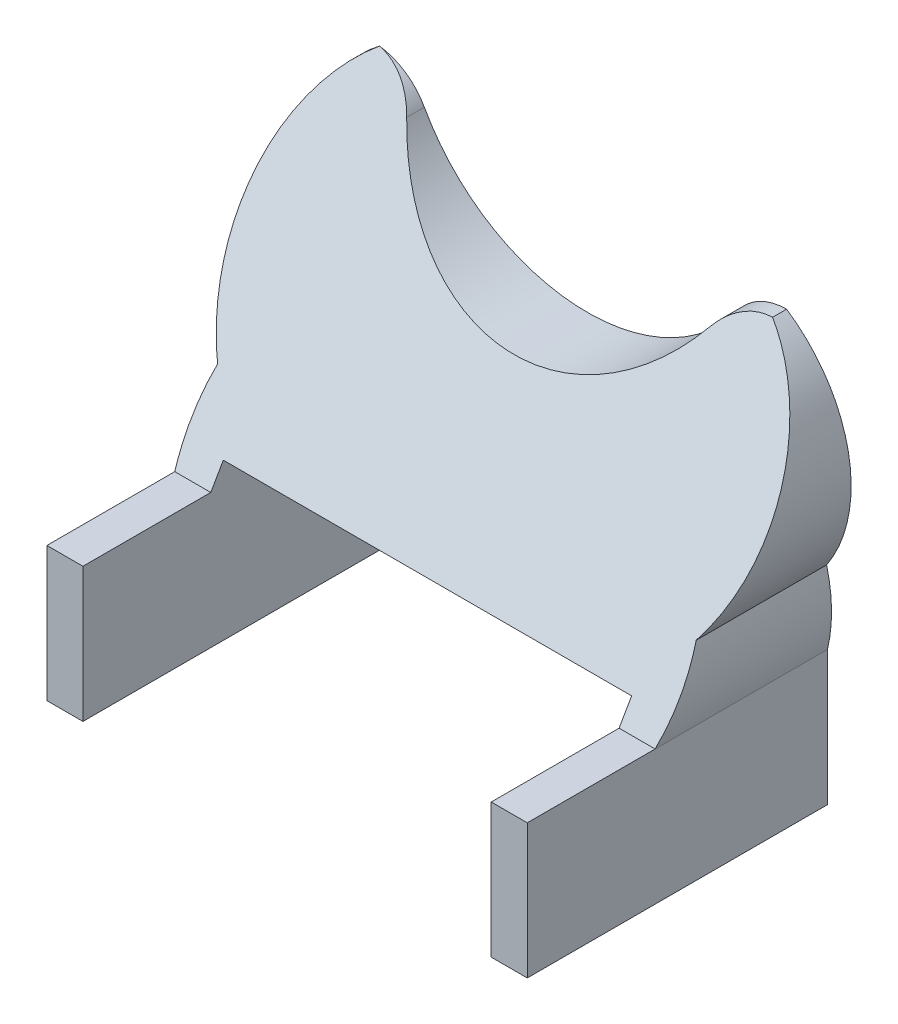
ISO-10303-21;
HEADER;
FILE_DESCRIPTION(('STEP AP214'),'2;1');
FILE_NAME('part.step','',(''),(''),'','','');
FILE_SCHEMA(('AUTOMOTIVE_DESIGN { 1 0 10303 214 1 1 1 1 }'));
ENDSEC;
DATA;
#1=APPLICATION_CONTEXT('core data for automotive mechanical design processes');
#2=APPLICATION_PROTOCOL_DEFINITION('international standard','automotive_design',2000,#1);
#3=PRODUCT_CONTEXT('',#1,'mechanical');
#4=PRODUCT('Part','Part','',(#3));
#5=PRODUCT_RELATED_PRODUCT_CATEGORY('part','',(#4));
#6=PRODUCT_DEFINITION_FORMATION('','',#4);
#7=PRODUCT_DEFINITION_CONTEXT('part definition',#1,'design');
#8=PRODUCT_DEFINITION('design','',#6,#7);
#9=PRODUCT_DEFINITION_SHAPE('','',#8);
#10=(LENGTH_UNIT() NAMED_UNIT(*) SI_UNIT(.MILLI.,.METRE.));
#11=(NAMED_UNIT(*) PLANE_ANGLE_UNIT() SI_UNIT($,.RADIAN.));
#12=(NAMED_UNIT(*) SI_UNIT($,.STERADIAN.) SOLID_ANGLE_UNIT());
#13=UNCERTAINTY_MEASURE_WITH_UNIT(LENGTH_MEASURE(1.E-05),#10,'distance_accuracy_value','');
#14=(GEOMETRIC_REPRESENTATION_CONTEXT(3) GLOBAL_UNCERTAINTY_ASSIGNED_CONTEXT((#13)) GLOBAL_UNIT_ASSIGNED_CONTEXT((#10,
#11,#12)) REPRESENTATION_CONTEXT('',''));
#15=CARTESIAN_POINT('',(0.,0.,0.));
#16=DIRECTION('',(0.,0.,1.));
#17=DIRECTION('',(1.,0.,0.));
#18=AXIS2_PLACEMENT_3D('',#15,#16,#17);
#19=CARTESIAN_POINT('',(0.,0.,25.));
#20=DIRECTION('',(0.,0.,-1.));
#21=DIRECTION('',(-1.,0.,0.));
#22=AXIS2_PLACEMENT_3D('',#19,#20,#21);
#23=PLANE('',#22);
#24=DIRECTION('',(1.,0.,0.));
#25=VECTOR('',#24,1.);
#26=CARTESIAN_POINT('',(-1.40000525819556E-13,-41.,25.));
#27=LINE('',#26,#25);
#28=CARTESIAN_POINT('',(-20.0000000000001,-41.,25.));
#29=VERTEX_POINT('',#28);
#30=CARTESIAN_POINT('',(-17.0000000000001,-41.,25.));
#31=VERTEX_POINT('',#30);
#32=EDGE_CURVE('E220',#29,#31,#27,.T.);
#33=ORIENTED_EDGE('',*,*,#32,.T.);
#34=DIRECTION('',(0.,-1.,0.));
#35=VECTOR('',#34,1.);
#36=CARTESIAN_POINT('',(-17.0000000000001,-28.,25.));
#37=LINE('',#36,#35);
#38=CARTESIAN_POINT('',(-17.0000000000001,-29.8077141482739,25.));
#39=VERTEX_POINT('',#38);
#40=EDGE_CURVE('E175',#39,#31,#37,.T.);
#41=ORIENTED_EDGE('',*,*,#40,.F.);
#42=DIRECTION('',(-1.,0.,0.));
#43=VECTOR('',#42,1.);
#44=CARTESIAN_POINT('',(19.9999999999999,-29.8077141482739,25.));
#45=LINE('',#44,#43);
#46=CARTESIAN_POINT('',(-20.0000000000001,-29.8077141482739,25.));
#47=VERTEX_POINT('',#46);
#48=EDGE_CURVE('E227',#39,#47,#45,.T.);
#49=ORIENTED_EDGE('',*,*,#48,.T.);
#50=DIRECTION('',(0.,-1.,0.));
#51=VECTOR('',#50,1.);
#52=CARTESIAN_POINT('',(-20.0000000000001,-29.8077141482739,25.));
#53=LINE('',#52,#51);
#54=EDGE_CURVE('E231',#47,#29,#53,.T.);
#55=ORIENTED_EDGE('',*,*,#54,.T.);
#56=EDGE_LOOP('',(#33,#41,#49,#55));
#57=FACE_BOUND('',#56,.T.);
#58=ADVANCED_FACE('F37',(#57),#23,.F.);
#59=CARTESIAN_POINT('',(19.9999999999999,-29.8077141482739,25.));
#60=DIRECTION('',(0.,-1.,0.));
#61=DIRECTION('',(1.,0.,0.));
#62=AXIS2_PLACEMENT_3D('',#59,#60,#61);
#63=PLANE('',#62);
#64=ORIENTED_EDGE('',*,*,#48,.F.);
#65=DIRECTION('',(0.,0.,-1.));
#66=VECTOR('',#65,1.);
#67=CARTESIAN_POINT('',(-17.0000000000001,-29.8077141482739,25.));
#68=LINE('',#67,#66);
#69=CARTESIAN_POINT('',(-17.0000000000001,-29.8077141482739,14.354853718367));
#70=VERTEX_POINT('',#69);
#71=EDGE_CURVE('E183',#39,#70,#68,.T.);
#72=ORIENTED_EDGE('',*,*,#71,.T.);
#73=DIRECTION('',(-1.,0.,0.));
#74=VECTOR('',#73,1.);
#75=CARTESIAN_POINT('',(25.,-29.8077141482739,14.354853718367));
#76=LINE('',#75,#74);
#77=CARTESIAN_POINT('',(-20.0000000000001,-29.8077141482739,14.354853718367));
#78=VERTEX_POINT('',#77);
#79=EDGE_CURVE('E187',#70,#78,#76,.T.);
#80=ORIENTED_EDGE('',*,*,#79,.T.);
#81=DIRECTION('',(0.,0.,-1.));
#82=VECTOR('',#81,1.);
#83=CARTESIAN_POINT('',(-20.0000000000001,-29.8077141482739,25.));
#84=LINE('',#83,#82);
#85=EDGE_CURVE('E244',#47,#78,#84,.T.);
#86=ORIENTED_EDGE('',*,*,#85,.F.);
#87=EDGE_LOOP('',(#64,#72,#80,#86));
#88=FACE_BOUND('',#87,.T.);
#89=ADVANCED_FACE('F340',(#88),#63,.F.);
#90=CARTESIAN_POINT('',(-1.40000525819556E-13,-41.,25.));
#91=DIRECTION('',(0.,1.,0.));
#92=DIRECTION('',(0.,0.,1.));
#93=AXIS2_PLACEMENT_3D('',#90,#91,#92);
#94=PLANE('',#93);
#95=DIRECTION('',(1.,0.,0.));
#96=VECTOR('',#95,1.);
#97=CARTESIAN_POINT('',(-1.40000525819556E-13,-41.,0.));
#98=LINE('',#97,#96);
#99=CARTESIAN_POINT('',(-20.0000000000001,-41.,0.));
#100=VERTEX_POINT('',#99);
#101=CARTESIAN_POINT('',(-17.0000000000001,-41.,0.));
#102=VERTEX_POINT('',#101);
#103=EDGE_CURVE('E239',#100,#102,#98,.T.);
#104=ORIENTED_EDGE('',*,*,#103,.T.);
#105=DIRECTION('',(0.,0.,-1.));
#106=VECTOR('',#105,1.);
#107=CARTESIAN_POINT('',(-17.0000000000001,-41.,25.));
#108=LINE('',#107,#106);
#109=EDGE_CURVE('E166',#31,#102,#108,.T.);
#110=ORIENTED_EDGE('',*,*,#109,.F.);
#111=ORIENTED_EDGE('',*,*,#32,.F.);
#112=DIRECTION('',(0.,0.,-1.));
#113=VECTOR('',#112,1.);
#114=CARTESIAN_POINT('',(-20.0000000000001,-41.,25.));
#115=LINE('',#114,#113);
#116=EDGE_CURVE('E234',#29,#100,#115,.T.);
#117=ORIENTED_EDGE('',*,*,#116,.T.);
#118=EDGE_LOOP('',(#104,#110,#111,#117));
#119=FACE_BOUND('',#118,.T.);
#120=ADVANCED_FACE('F334',(#119),#94,.F.);
#121=CARTESIAN_POINT('',(0.,0.,25.));
#122=DIRECTION('',(0.,0.,-1.));
#123=DIRECTION('',(-1.,0.,0.));
#124=AXIS2_PLACEMENT_3D('',#121,#122,#123);
#125=CYLINDRICAL_SURFACE('',#124,15.5);
#126=CARTESIAN_POINT('',(0.,0.,-2.85463806906635));
#127=DIRECTION('',(0.,0.5,0.866025403784439));
#128=DIRECTION('',(0.,0.866025403784439,-0.5));
#129=AXIS2_PLACEMENT_3D('',#126,#127,#128);
#130=ELLIPSE('',#129,17.8978583448784,15.5);
#131=CARTESIAN_POINT('',(12.5832877955796,-9.05046232264509,2.37064878920336));
#132=VERTEX_POINT('',#131);
#133=CARTESIAN_POINT('',(-13.5714816505885,-7.48764888384456,1.46835802961871));
#134=VERTEX_POINT('',#133);
#135=EDGE_CURVE('E195',#132,#134,#130,.F.);
#136=ORIENTED_EDGE('',*,*,#135,.F.);
#137=DIRECTION('',(0.,0.,-1.));
#138=VECTOR('',#137,1.);
#139=CARTESIAN_POINT('',(12.5832877955796,-9.05046232264509,25.));
#140=LINE('',#139,#138);
#141=CARTESIAN_POINT('',(12.5832877955796,-9.05046232264509,0.));
#142=VERTEX_POINT('',#141);
#143=EDGE_CURVE('E267',#132,#142,#140,.T.);
#144=ORIENTED_EDGE('',*,*,#143,.T.);
#145=CARTESIAN_POINT('',(0.,0.,0.));
#146=DIRECTION('',(0.,0.,-1.));
#147=DIRECTION('',(-1.,0.,0.));
#148=AXIS2_PLACEMENT_3D('',#145,#146,#147);
#149=CIRCLE('',#148,15.5);
#150=CARTESIAN_POINT('',(-13.5714816505885,-7.48764888384456,0.));
#151=VERTEX_POINT('',#150);
#152=EDGE_CURVE('E251',#142,#151,#149,.T.);
#153=ORIENTED_EDGE('',*,*,#152,.T.);
#154=DIRECTION('',(0.,0.,-1.));
#155=VECTOR('',#154,1.);
#156=CARTESIAN_POINT('',(-13.5714816505885,-7.48764888384456,25.));
#157=LINE('',#156,#155);
#158=EDGE_CURVE('E269',#151,#134,#157,.F.);
#159=ORIENTED_EDGE('',*,*,#158,.T.);
#160=EDGE_LOOP('',(#136,#144,#153,#159));
#161=FACE_BOUND('',#160,.T.);
#162=ADVANCED_FACE('F316',(#161),#125,.F.);
#163=CARTESIAN_POINT('',(-9.21550970979447,-15.6552843633315,25.));
#164=DIRECTION('',(0.,0.,-1.));
#165=DIRECTION('',(-1.,0.,0.));
#166=AXIS2_PLACEMENT_3D('',#163,#164,#165);
#167=CYLINDRICAL_SURFACE('',#166,13.4240637135171);
#168=CARTESIAN_POINT('',(-9.21550970979447,-15.6552843633315,6.18394457234322));
#169=DIRECTION('',(0.,0.5,0.866025403784439));
#170=DIRECTION('',(0.,0.866025403784439,-0.5));
#171=AXIS2_PLACEMENT_3D('',#168,#169,#170);
#172=ELLIPSE('',#171,15.5007735972356,13.4240637135171);
#173=CARTESIAN_POINT('',(-17.3076030831513,-4.94437817284324,0.));
#174=VERTEX_POINT('',#173);
#175=CARTESIAN_POINT('',(-19.9264159002828,-23.7473777366882,10.8559168597583));
#176=VERTEX_POINT('',#175);
#177=EDGE_CURVE('E200',#174,#176,#172,.T.);
#178=ORIENTED_EDGE('',*,*,#177,.F.);
#179=CARTESIAN_POINT('',(-9.21550970979447,-15.6552843633315,0.));
#180=DIRECTION('',(0.,0.,1.));
#181=DIRECTION('',(1.,0.,0.));
#182=AXIS2_PLACEMENT_3D('',#179,#180,#181);
#183=CIRCLE('',#182,13.4240637135171);
#184=CARTESIAN_POINT('',(-19.9264159002828,-23.7473777366882,0.));
#185=VERTEX_POINT('',#184);
#186=EDGE_CURVE('E254',#174,#185,#183,.T.);
#187=ORIENTED_EDGE('',*,*,#186,.T.);
#188=DIRECTION('',(0.,0.,-1.));
#189=VECTOR('',#188,1.);
#190=CARTESIAN_POINT('',(-19.9264159002828,-23.7473777366882,15.));
#191=LINE('',#190,#189);
#192=EDGE_CURVE('E215',#176,#185,#191,.T.);
#193=ORIENTED_EDGE('',*,*,#192,.F.);
#194=EDGE_LOOP('',(#178,#187,#193));
#195=FACE_BOUND('',#194,.T.);
#196=ADVANCED_FACE('F323',(#195),#167,.T.);
#197=CARTESIAN_POINT('',(9.87245039145922,-17.0241502272151,25.));
#198=DIRECTION('',(0.,0.,-1.));
#199=DIRECTION('',(-1.,0.,0.));
#200=AXIS2_PLACEMENT_3D('',#197,#198,#199);
#201=CYLINDRICAL_SURFACE('',#200,12.0947927058197);
#202=CARTESIAN_POINT('',(9.87245039145922,-17.0241502272151,6.97425964734091));
#203=DIRECTION('',(0.,0.5,0.866025403784439));
#204=DIRECTION('',(0.,0.866025403784439,-0.5));
#205=AXIS2_PLACEMENT_3D('',#202,#203,#204);
#206=ELLIPSE('',#205,13.9658636489955,12.0947927058197);
#207=CARTESIAN_POINT('',(19.9264159002827,-23.7473777366883,10.8559168597584));
#208=VERTEX_POINT('',#207);
#209=CARTESIAN_POINT('',(16.5956779009325,-6.97018471839165,1.16959995439848));
#210=VERTEX_POINT('',#209);
#211=EDGE_CURVE('E190',#208,#210,#206,.T.);
#212=ORIENTED_EDGE('',*,*,#211,.F.);
#213=DIRECTION('',(0.,0.,-1.));
#214=VECTOR('',#213,1.);
#215=CARTESIAN_POINT('',(19.9264159002827,-23.7473777366883,15.));
#216=LINE('',#215,#214);
#217=CARTESIAN_POINT('',(19.9264159002827,-23.7473777366883,0.));
#218=VERTEX_POINT('',#217);
#219=EDGE_CURVE('E205',#208,#218,#216,.T.);
#220=ORIENTED_EDGE('',*,*,#219,.T.);
#221=CARTESIAN_POINT('',(9.87245039145922,-17.0241502272151,0.));
#222=DIRECTION('',(0.,0.,1.));
#223=DIRECTION('',(-1.,0.,0.));
#224=AXIS2_PLACEMENT_3D('',#221,#222,#223);
#225=CIRCLE('',#224,12.0947927058197);
#226=CARTESIAN_POINT('',(16.5956779009325,-6.97018471839165,0.));
#227=VERTEX_POINT('',#226);
#228=EDGE_CURVE('E257',#218,#227,#225,.T.);
#229=ORIENTED_EDGE('',*,*,#228,.T.);
#230=DIRECTION('',(0.,0.,-1.));
#231=VECTOR('',#230,1.);
#232=CARTESIAN_POINT('',(16.5956779009325,-6.97018471839165,25.));
#233=LINE('',#232,#231);
#234=EDGE_CURVE('E260',#210,#227,#233,.T.);
#235=ORIENTED_EDGE('',*,*,#234,.F.);
#236=EDGE_LOOP('',(#212,#220,#229,#235));
#237=FACE_BOUND('',#236,.T.);
#238=ADVANCED_FACE('F305',(#237),#201,.T.);
#239=CARTESIAN_POINT('',(19.9999999999999,-29.8077141482739,25.));
#240=VERTEX_POINT('',#239);
#241=CARTESIAN_POINT('',(16.9999999999999,-29.8077141482739,25.));
#242=VERTEX_POINT('',#241);
#243=EDGE_CURVE('E228',#240,#242,#45,.T.);
#244=ORIENTED_EDGE('',*,*,#243,.T.);
#245=DIRECTION('',(0.,-1.,0.));
#246=VECTOR('',#245,1.);
#247=CARTESIAN_POINT('',(16.9999999999999,-28.,25.));
#248=LINE('',#247,#246);
#249=CARTESIAN_POINT('',(16.9999999999999,-41.,25.));
#250=VERTEX_POINT('',#249);
#251=EDGE_CURVE('E172',#242,#250,#248,.T.);
#252=ORIENTED_EDGE('',*,*,#251,.T.);
#253=CARTESIAN_POINT('',(19.9999999999999,-41.,25.));
#254=VERTEX_POINT('',#253);
#255=EDGE_CURVE('E224',#250,#254,#27,.T.);
#256=ORIENTED_EDGE('',*,*,#255,.T.);
#257=DIRECTION('',(0.,1.,0.));
#258=VECTOR('',#257,1.);
#259=CARTESIAN_POINT('',(19.9999999999999,-41.,25.));
#260=LINE('',#259,#258);
#261=EDGE_CURVE('E223',#254,#240,#260,.T.);
#262=ORIENTED_EDGE('',*,*,#261,.T.);
#263=EDGE_LOOP('',(#244,#252,#256,#262));
#264=FACE_BOUND('',#263,.T.);
#265=ADVANCED_FACE('F290',(#264),#23,.F.);
#266=CARTESIAN_POINT('',(-17.94937895723,-9.90301949153635,25.));
#267=DIRECTION('',(0.,0.,-1.));
#268=DIRECTION('',(-1.,0.,0.));
#269=AXIS2_PLACEMENT_3D('',#266,#267,#268);
#270=CYLINDRICAL_SURFACE('',#269,5.);
#271=CARTESIAN_POINT('',(-17.94937895723,-9.90301949153635,0.));
#272=DIRECTION('',(0.,0.,-1.));
#273=DIRECTION('',(-1.,0.,0.));
#274=AXIS2_PLACEMENT_3D('',#271,#272,#273);
#275=CIRCLE('',#274,5.);
#276=EDGE_CURVE('E265',#174,#151,#275,.T.);
#277=ORIENTED_EDGE('',*,*,#276,.F.);
#278=CARTESIAN_POINT('',(-17.94937895723,-9.90301949153635,2.86287290016227));
#279=DIRECTION('',(0.,0.5,0.866025403784439));
#280=DIRECTION('',(0.,0.866025403784439,-0.5));
#281=AXIS2_PLACEMENT_3D('',#278,#279,#280);
#282=ELLIPSE('',#281,5.77350269189626,5.);
#283=EDGE_CURVE('E197',#174,#134,#282,.F.);
#284=ORIENTED_EDGE('',*,*,#283,.T.);
#285=ORIENTED_EDGE('',*,*,#158,.F.);
#286=EDGE_LOOP('',(#277,#284,#285));
#287=FACE_BOUND('',#286,.T.);
#288=ADVANCED_FACE('F318',(#287),#270,.T.);
#289=CARTESIAN_POINT('',(16.6424128909278,-11.9699662976919,25.));
#290=DIRECTION('',(0.,0.,-1.));
#291=DIRECTION('',(-1.,0.,0.));
#292=AXIS2_PLACEMENT_3D('',#289,#290,#291);
#293=CYLINDRICAL_SURFACE('',#292,5.);
#294=ORIENTED_EDGE('',*,*,#143,.F.);
#295=CARTESIAN_POINT('',(16.6424128909278,-11.9699662976919,4.05622519509681));
#296=DIRECTION('',(0.,0.5,0.866025403784439));
#297=DIRECTION('',(0.,0.866025403784439,-0.5));
#298=AXIS2_PLACEMENT_3D('',#295,#296,#297);
#299=ELLIPSE('',#298,5.77350269189626,5.);
#300=EDGE_CURVE('E192',#132,#210,#299,.F.);
#301=ORIENTED_EDGE('',*,*,#300,.T.);
#302=ORIENTED_EDGE('',*,*,#234,.T.);
#303=CARTESIAN_POINT('',(16.6424128909278,-11.9699662976919,0.));
#304=DIRECTION('',(0.,0.,-1.));
#305=DIRECTION('',(-1.,0.,0.));
#306=AXIS2_PLACEMENT_3D('',#303,#304,#305);
#307=CIRCLE('',#306,5.);
#308=EDGE_CURVE('E262',#142,#227,#307,.T.);
#309=ORIENTED_EDGE('',*,*,#308,.F.);
#310=EDGE_LOOP('',(#294,#301,#302,#309));
#311=FACE_BOUND('',#310,.T.);
#312=ADVANCED_FACE('F39',(#311),#293,.T.);
#313=CARTESIAN_POINT('',(-6.01674441011245,-26.9468827406613,15.));
#314=DIRECTION('',(0.,0.,-1.));
#315=DIRECTION('',(-1.,0.,0.));
#316=AXIS2_PLACEMENT_3D('',#313,#314,#315);
#317=CYLINDRICAL_SURFACE('',#316,14.272904162605);
#318=CARTESIAN_POINT('',(-6.01674441011245,-26.9468827406613,12.7031519350757));
#319=DIRECTION('',(0.,0.5,0.866025403784439));
#320=DIRECTION('',(0.,0.866025403784439,-0.5));
#321=AXIS2_PLACEMENT_3D('',#318,#319,#320);
#322=ELLIPSE('',#321,16.4809301207955,14.272904162605);
#323=EDGE_CURVE('E202',#176,#78,#322,.T.);
#324=ORIENTED_EDGE('',*,*,#323,.F.);
#325=ORIENTED_EDGE('',*,*,#192,.T.);
#326=CARTESIAN_POINT('',(-6.01674441011245,-26.9468827406613,0.));
#327=DIRECTION('',(0.,0.,1.));
#328=DIRECTION('',(1.,0.,0.));
#329=AXIS2_PLACEMENT_3D('',#326,#327,#328);
#330=CIRCLE('',#329,14.272904162605);
#331=CARTESIAN_POINT('',(-20.0000000000001,-29.8077141482739,0.));
#332=VERTEX_POINT('',#331);
#333=EDGE_CURVE('E212',#185,#332,#330,.T.);
#334=ORIENTED_EDGE('',*,*,#333,.T.);
#335=DIRECTION('',(0.,0.,-1.));
#336=VECTOR('',#335,1.);
#337=CARTESIAN_POINT('',(-20.0000000000001,-29.8077141482739,15.));
#338=LINE('',#337,#336);
#339=EDGE_CURVE('E217',#78,#332,#338,.T.);
#340=ORIENTED_EDGE('',*,*,#339,.F.);
#341=EDGE_LOOP('',(#324,#325,#334,#340));
#342=FACE_BOUND('',#341,.T.);
#343=ADVANCED_FACE('F326',(#342),#317,.T.);
#344=CARTESIAN_POINT('',(7.76933212027765,-26.9256029667229,15.));
#345=DIRECTION('',(0.,0.,-1.));
#346=DIRECTION('',(-1.,0.,0.));
#347=AXIS2_PLACEMENT_3D('',#344,#345,#346);
#348=CYLINDRICAL_SURFACE('',#347,12.5656596184558);
#349=CARTESIAN_POINT('',(7.76933212027765,-26.9256029667229,12.6908660518641));
#350=DIRECTION('',(0.,0.5,0.866025403784439));
#351=DIRECTION('',(0.,0.866025403784439,-0.5));
#352=AXIS2_PLACEMENT_3D('',#349,#350,#351);
#353=ELLIPSE('',#352,14.5095739265213,12.5656596184558);
#354=CARTESIAN_POINT('',(19.9999999999999,-29.8077141482739,14.354853718367));
#355=VERTEX_POINT('',#354);
#356=EDGE_CURVE('E272',#355,#208,#353,.T.);
#357=ORIENTED_EDGE('',*,*,#356,.F.);
#358=DIRECTION('',(0.,0.,-1.));
#359=VECTOR('',#358,1.);
#360=CARTESIAN_POINT('',(19.9999999999999,-29.8077141482739,15.));
#361=LINE('',#360,#359);
#362=CARTESIAN_POINT('',(19.9999999999999,-29.8077141482739,0.));
#363=VERTEX_POINT('',#362);
#364=EDGE_CURVE('E207',#355,#363,#361,.T.);
#365=ORIENTED_EDGE('',*,*,#364,.T.);
#366=CARTESIAN_POINT('',(7.76933212027765,-26.9256029667229,0.));
#367=DIRECTION('',(0.,0.,1.));
#368=DIRECTION('',(1.,0.,0.));
#369=AXIS2_PLACEMENT_3D('',#366,#367,#368);
#370=CIRCLE('',#369,12.5656596184558);
#371=EDGE_CURVE('E209',#363,#218,#370,.T.);
#372=ORIENTED_EDGE('',*,*,#371,.T.);
#373=ORIENTED_EDGE('',*,*,#219,.F.);
#374=EDGE_LOOP('',(#357,#365,#372,#373));
#375=FACE_BOUND('',#374,.T.);
#376=ADVANCED_FACE('F300',(#375),#348,.T.);
#377=CARTESIAN_POINT('',(0.,0.,0.));
#378=DIRECTION('',(0.,0.,-1.));
#379=DIRECTION('',(-1.,0.,0.));
#380=AXIS2_PLACEMENT_3D('',#377,#378,#379);
#381=PLANE('',#380);
#382=DIRECTION('',(0.,-1.,0.));
#383=VECTOR('',#382,1.);
#384=CARTESIAN_POINT('',(-17.0000000000001,-28.,0.));
#385=LINE('',#384,#383);
#386=CARTESIAN_POINT('',(-17.0000000000001,-28.,0.));
#387=VERTEX_POINT('',#386);
#388=EDGE_CURVE('E184',#387,#102,#385,.T.);
#389=ORIENTED_EDGE('',*,*,#388,.T.);
#390=ORIENTED_EDGE('',*,*,#103,.F.);
#391=DIRECTION('',(0.,-1.,0.));
#392=VECTOR('',#391,1.);
#393=CARTESIAN_POINT('',(-20.0000000000001,-29.8077141482739,0.));
#394=LINE('',#393,#392);
#395=EDGE_CURVE('E237',#332,#100,#394,.T.);
#396=ORIENTED_EDGE('',*,*,#395,.F.);
#397=ORIENTED_EDGE('',*,*,#333,.F.);
#398=ORIENTED_EDGE('',*,*,#186,.F.);
#399=ORIENTED_EDGE('',*,*,#276,.T.);
#400=ORIENTED_EDGE('',*,*,#152,.F.);
#401=ORIENTED_EDGE('',*,*,#308,.T.);
#402=ORIENTED_EDGE('',*,*,#228,.F.);
#403=ORIENTED_EDGE('',*,*,#371,.F.);
#404=DIRECTION('',(0.,1.,0.));
#405=VECTOR('',#404,1.);
#406=CARTESIAN_POINT('',(19.9999999999999,-41.,0.));
#407=LINE('',#406,#405);
#408=CARTESIAN_POINT('',(19.9999999999999,-41.,0.));
#409=VERTEX_POINT('',#408);
#410=EDGE_CURVE('E219',#409,#363,#407,.T.);
#411=ORIENTED_EDGE('',*,*,#410,.F.);
#412=CARTESIAN_POINT('',(16.9999999999999,-41.,0.));
#413=VERTEX_POINT('',#412);
#414=EDGE_CURVE('E171',#413,#409,#98,.T.);
#415=ORIENTED_EDGE('',*,*,#414,.F.);
#416=DIRECTION('',(0.,-1.,0.));
#417=VECTOR('',#416,1.);
#418=CARTESIAN_POINT('',(16.9999999999999,-28.,0.));
#419=LINE('',#418,#417);
#420=CARTESIAN_POINT('',(16.9999999999999,-28.,0.));
#421=VERTEX_POINT('',#420);
#422=EDGE_CURVE('E153',#421,#413,#419,.T.);
#423=ORIENTED_EDGE('',*,*,#422,.F.);
#424=DIRECTION('',(1.,0.,0.));
#425=VECTOR('',#424,1.);
#426=CARTESIAN_POINT('',(-17.0000000000001,-28.,0.));
#427=LINE('',#426,#425);
#428=EDGE_CURVE('E158',#387,#421,#427,.T.);
#429=ORIENTED_EDGE('',*,*,#428,.F.);
#430=EDGE_LOOP('',(#389,#390,#396,#397,#398,#399,#400,#401,#402,#403,#411,#415,#423,#429));
#431=FACE_BOUND('',#430,.T.);
#432=ADVANCED_FACE('F169',(#431),#381,.T.);
#433=CARTESIAN_POINT('',(16.9999999999999,-29.8077141482739,14.354853718367));
#434=VERTEX_POINT('',#433);
#435=EDGE_CURVE('E188',#355,#434,#76,.T.);
#436=ORIENTED_EDGE('',*,*,#435,.T.);
#437=DIRECTION('',(0.,0.,1.));
#438=VECTOR('',#437,1.);
#439=CARTESIAN_POINT('',(16.9999999999999,-29.8077141482739,25.));
#440=LINE('',#439,#438);
#441=EDGE_CURVE('E180',#434,#242,#440,.T.);
#442=ORIENTED_EDGE('',*,*,#441,.T.);
#443=ORIENTED_EDGE('',*,*,#243,.F.);
#444=DIRECTION('',(0.,0.,-1.));
#445=VECTOR('',#444,1.);
#446=CARTESIAN_POINT('',(19.9999999999999,-29.8077141482739,25.));
#447=LINE('',#446,#445);
#448=EDGE_CURVE('E60',#240,#355,#447,.T.);
#449=ORIENTED_EDGE('',*,*,#448,.T.);
#450=EDGE_LOOP('',(#436,#442,#443,#449));
#451=FACE_BOUND('',#450,.T.);
#452=ADVANCED_FACE('F343',(#451),#63,.F.);
#453=CARTESIAN_POINT('',(19.9999999999999,-41.,25.));
#454=DIRECTION('',(-1.,0.,0.));
#455=DIRECTION('',(0.,0.,1.));
#456=AXIS2_PLACEMENT_3D('',#453,#454,#455);
#457=PLANE('',#456);
#458=ORIENTED_EDGE('',*,*,#410,.T.);
#459=ORIENTED_EDGE('',*,*,#364,.F.);
#460=ORIENTED_EDGE('',*,*,#448,.F.);
#461=ORIENTED_EDGE('',*,*,#261,.F.);
#462=DIRECTION('',(0.,0.,-1.));
#463=VECTOR('',#462,1.);
#464=CARTESIAN_POINT('',(19.9999999999999,-41.,25.));
#465=LINE('',#464,#463);
#466=EDGE_CURVE('E248',#254,#409,#465,.T.);
#467=ORIENTED_EDGE('',*,*,#466,.T.);
#468=EDGE_LOOP('',(#458,#459,#460,#461,#467));
#469=FACE_BOUND('',#468,.T.);
#470=ADVANCED_FACE('F295',(#469),#457,.F.);
#471=CARTESIAN_POINT('',(-20.0000000000001,-29.8077141482739,25.));
#472=DIRECTION('',(1.,0.,0.));
#473=DIRECTION('',(0.,1.,0.));
#474=AXIS2_PLACEMENT_3D('',#471,#472,#473);
#475=PLANE('',#474);
#476=ORIENTED_EDGE('',*,*,#395,.T.);
#477=ORIENTED_EDGE('',*,*,#116,.F.);
#478=ORIENTED_EDGE('',*,*,#54,.F.);
#479=ORIENTED_EDGE('',*,*,#85,.T.);
#480=ORIENTED_EDGE('',*,*,#339,.T.);
#481=EDGE_LOOP('',(#476,#477,#478,#479,#480));
#482=FACE_BOUND('',#481,.T.);
#483=ADVANCED_FACE('F331',(#482),#475,.F.);
#484=ORIENTED_EDGE('',*,*,#255,.F.);
#485=DIRECTION('',(0.,0.,1.));
#486=VECTOR('',#485,1.);
#487=CARTESIAN_POINT('',(16.9999999999999,-41.,0.));
#488=LINE('',#487,#486);
#489=EDGE_CURVE('E286',#413,#250,#488,.T.);
#490=ORIENTED_EDGE('',*,*,#489,.F.);
#491=ORIENTED_EDGE('',*,*,#414,.T.);
#492=ORIENTED_EDGE('',*,*,#466,.F.);
#493=EDGE_LOOP('',(#484,#490,#491,#492));
#494=FACE_BOUND('',#493,.T.);
#495=ADVANCED_FACE('F293',(#494),#94,.F.);
#496=CARTESIAN_POINT('',(25.,-29.8077141482739,14.354853718367));
#497=DIRECTION('',(0.,0.5,0.866025403784439));
#498=DIRECTION('',(0.,-0.866025403784439,0.5));
#499=AXIS2_PLACEMENT_3D('',#496,#497,#498);
#500=PLANE('',#499);
#501=DIRECTION('',(0.,-0.866025403784439,0.5));
#502=VECTOR('',#501,1.);
#503=CARTESIAN_POINT('',(-17.0000000000001,-29.8077141482739,14.354853718367));
#504=LINE('',#503,#502);
#505=CARTESIAN_POINT('',(-17.0000000000001,-28.,13.3111694682432));
#506=VERTEX_POINT('',#505);
#507=EDGE_CURVE('E11',#506,#70,#504,.T.);
#508=ORIENTED_EDGE('',*,*,#507,.F.);
#509=DIRECTION('',(1.,0.,0.));
#510=VECTOR('',#509,1.);
#511=CARTESIAN_POINT('',(25.,-28.,13.3111694682432));
#512=LINE('',#511,#510);
#513=CARTESIAN_POINT('',(16.9999999999999,-28.,13.3111694682432));
#514=VERTEX_POINT('',#513);
#515=EDGE_CURVE('E274',#506,#514,#512,.T.);
#516=ORIENTED_EDGE('',*,*,#515,.T.);
#517=DIRECTION('',(0.,0.866025403784439,-0.5));
#518=VECTOR('',#517,1.);
#519=CARTESIAN_POINT('',(16.9999999999999,-29.8077141482739,14.354853718367));
#520=LINE('',#519,#518);
#521=EDGE_CURVE('E45',#434,#514,#520,.T.);
#522=ORIENTED_EDGE('',*,*,#521,.F.);
#523=ORIENTED_EDGE('',*,*,#435,.F.);
#524=ORIENTED_EDGE('',*,*,#356,.T.);
#525=ORIENTED_EDGE('',*,*,#211,.T.);
#526=ORIENTED_EDGE('',*,*,#300,.F.);
#527=ORIENTED_EDGE('',*,*,#135,.T.);
#528=ORIENTED_EDGE('',*,*,#283,.F.);
#529=ORIENTED_EDGE('',*,*,#177,.T.);
#530=ORIENTED_EDGE('',*,*,#323,.T.);
#531=ORIENTED_EDGE('',*,*,#79,.F.);
#532=EDGE_LOOP('',(#508,#516,#522,#523,#524,#525,#526,#527,#528,#529,#530,#531));
#533=FACE_BOUND('',#532,.T.);
#534=ADVANCED_FACE('F277',(#533),#500,.T.);
#535=CARTESIAN_POINT('',(-17.0000000000001,-28.,25.));
#536=DIRECTION('',(-1.,0.,0.));
#537=DIRECTION('',(0.,0.,1.));
#538=AXIS2_PLACEMENT_3D('',#535,#536,#537);
#539=PLANE('',#538);
#540=ORIENTED_EDGE('',*,*,#40,.T.);
#541=ORIENTED_EDGE('',*,*,#109,.T.);
#542=ORIENTED_EDGE('',*,*,#388,.F.);
#543=DIRECTION('',(0.,0.,-1.));
#544=VECTOR('',#543,1.);
#545=CARTESIAN_POINT('',(-17.0000000000001,-28.,25.));
#546=LINE('',#545,#544);
#547=EDGE_CURVE('E157',#506,#387,#546,.T.);
#548=ORIENTED_EDGE('',*,*,#547,.F.);
#549=ORIENTED_EDGE('',*,*,#507,.T.);
#550=ORIENTED_EDGE('',*,*,#71,.F.);
#551=EDGE_LOOP('',(#540,#541,#542,#548,#549,#550));
#552=FACE_BOUND('',#551,.T.);
#553=ADVANCED_FACE('F280',(#552),#539,.F.);
#554=CARTESIAN_POINT('',(16.9999999999999,-28.,0.));
#555=DIRECTION('',(1.,0.,0.));
#556=DIRECTION('',(0.,0.,-1.));
#557=AXIS2_PLACEMENT_3D('',#554,#555,#556);
#558=PLANE('',#557);
#559=ORIENTED_EDGE('',*,*,#521,.T.);
#560=DIRECTION('',(0.,0.,1.));
#561=VECTOR('',#560,1.);
#562=CARTESIAN_POINT('',(16.9999999999999,-28.,0.));
#563=LINE('',#562,#561);
#564=EDGE_CURVE('E52',#421,#514,#563,.T.);
#565=ORIENTED_EDGE('',*,*,#564,.F.);
#566=ORIENTED_EDGE('',*,*,#422,.T.);
#567=ORIENTED_EDGE('',*,*,#489,.T.);
#568=ORIENTED_EDGE('',*,*,#251,.F.);
#569=ORIENTED_EDGE('',*,*,#441,.F.);
#570=EDGE_LOOP('',(#559,#565,#566,#567,#568,#569));
#571=FACE_BOUND('',#570,.T.);
#572=ADVANCED_FACE('F151',(#571),#558,.F.);
#573=CARTESIAN_POINT('',(0.,-28.,0.));
#574=DIRECTION('',(0.,-1.,0.));
#575=DIRECTION('',(0.,0.,-1.));
#576=AXIS2_PLACEMENT_3D('',#573,#574,#575);
#577=PLANE('',#576);
#578=ORIENTED_EDGE('',*,*,#547,.T.);
#579=ORIENTED_EDGE('',*,*,#428,.T.);
#580=ORIENTED_EDGE('',*,*,#564,.T.);
#581=ORIENTED_EDGE('',*,*,#515,.F.);
#582=EDGE_LOOP('',(#578,#579,#580,#581));
#583=FACE_BOUND('',#582,.T.);
#584=ADVANCED_FACE('F161',(#583),#577,.T.);
#585=CLOSED_SHELL('',(#58,#89,#120,#162,#196,#238,#265,#288,#312,#343,#376,#432,#452,#470,#483,
#495,#534,#553,#572,#584));
#586=MANIFOLD_SOLID_BREP('B2',#585);
#587=ADVANCED_BREP_SHAPE_REPRESENTATION('',(#18,#586),#14);
#588=SHAPE_DEFINITION_REPRESENTATION(#9,#587);
ENDSEC;
END-ISO-10303-21;
